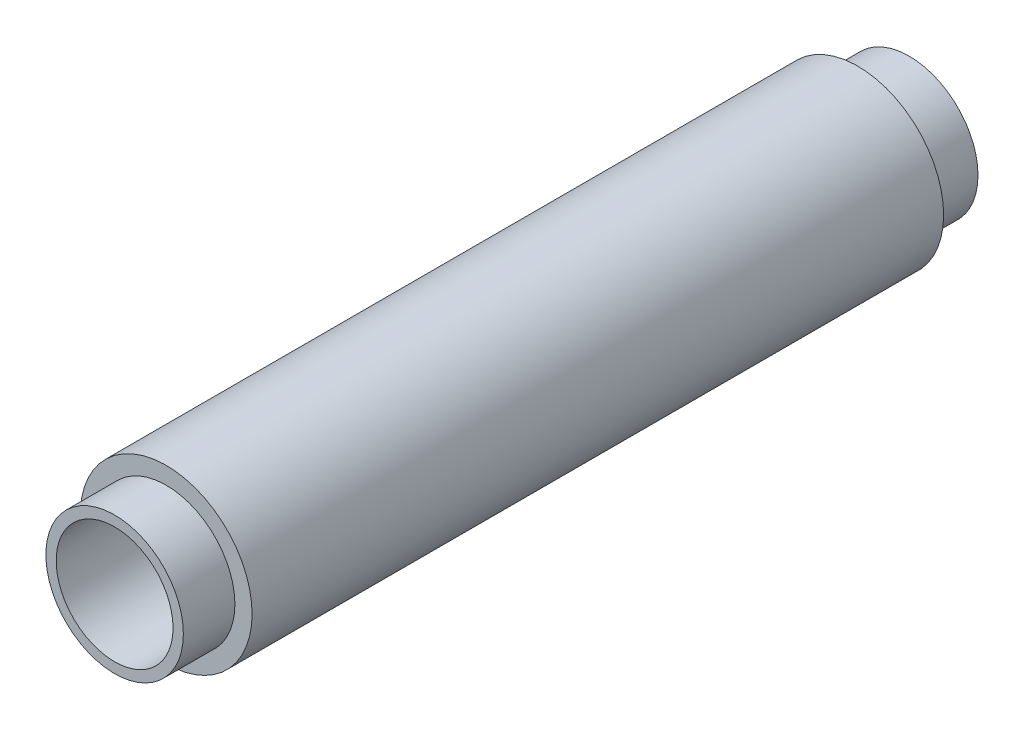
ISO-10303-21;
HEADER;
FILE_DESCRIPTION(('STEP AP214'),'2;1');
FILE_NAME('part.step','',(''),(''),'','','');
FILE_SCHEMA(('AUTOMOTIVE_DESIGN { 1 0 10303 214 1 1 1 1 }'));
ENDSEC;
DATA;
#1=APPLICATION_CONTEXT('core data for automotive mechanical design processes');
#2=APPLICATION_PROTOCOL_DEFINITION('international standard','automotive_design',2000,#1);
#3=PRODUCT_CONTEXT('',#1,'mechanical');
#4=PRODUCT('Part','Part','',(#3));
#5=PRODUCT_RELATED_PRODUCT_CATEGORY('part','',(#4));
#6=PRODUCT_DEFINITION_FORMATION('','',#4);
#7=PRODUCT_DEFINITION_CONTEXT('part definition',#1,'design');
#8=PRODUCT_DEFINITION('design','',#6,#7);
#9=PRODUCT_DEFINITION_SHAPE('','',#8);
#10=(LENGTH_UNIT() NAMED_UNIT(*) SI_UNIT(.MILLI.,.METRE.));
#11=(NAMED_UNIT(*) PLANE_ANGLE_UNIT() SI_UNIT($,.RADIAN.));
#12=(NAMED_UNIT(*) SI_UNIT($,.STERADIAN.) SOLID_ANGLE_UNIT());
#13=UNCERTAINTY_MEASURE_WITH_UNIT(LENGTH_MEASURE(1.E-05),#10,'distance_accuracy_value','');
#14=(GEOMETRIC_REPRESENTATION_CONTEXT(3) GLOBAL_UNCERTAINTY_ASSIGNED_CONTEXT((#13)) GLOBAL_UNIT_ASSIGNED_CONTEXT((#10,
#11,#12)) REPRESENTATION_CONTEXT('',''));
#15=CARTESIAN_POINT('',(0.,0.,0.));
#16=DIRECTION('',(0.,0.,1.));
#17=DIRECTION('',(1.,0.,0.));
#18=AXIS2_PLACEMENT_3D('',#15,#16,#17);
#19=CARTESIAN_POINT('',(3.43024899888577E-12,0.,1000.));
#20=DIRECTION('',(0.,0.,1.));
#21=DIRECTION('',(1.,0.,0.));
#22=AXIS2_PLACEMENT_3D('',#19,#20,#21);
#23=CYLINDRICAL_SURFACE('',#22,25.0000000000002);
#24=CARTESIAN_POINT('',(3.45083049287907E-13,0.,100.6));
#25=DIRECTION('',(0.,0.,1.));
#26=DIRECTION('',(1.,0.,0.));
#27=AXIS2_PLACEMENT_3D('',#24,#25,#26);
#28=CIRCLE('',#27,25.0000000000003);
#29=CARTESIAN_POINT('',(25.0000000000007,0.,100.599999999999));
#30=VERTEX_POINT('',#29);
#31=EDGE_CURVE('E47',#30,#30,#28,.T.);
#32=ORIENTED_EDGE('',*,*,#31,.F.);
#33=EDGE_LOOP('',(#32));
#34=FACE_BOUND('',#33,.T.);
#35=CARTESIAN_POINT('',(-3.45083049287907E-13,0.,-100.6));
#36=DIRECTION('',(0.,0.,1.));
#37=DIRECTION('',(1.,0.,0.));
#38=AXIS2_PLACEMENT_3D('',#35,#36,#37);
#39=CIRCLE('',#38,25.0000000000003);
#40=CARTESIAN_POINT('',(25.,0.,-100.6));
#41=VERTEX_POINT('',#40);
#42=EDGE_CURVE('E61',#41,#41,#39,.T.);
#43=ORIENTED_EDGE('',*,*,#42,.T.);
#44=EDGE_LOOP('',(#43));
#45=FACE_BOUND('',#44,.T.);
#46=ADVANCED_FACE('F33',(#34,#45),#23,.T.);
#47=CARTESIAN_POINT('',(3.43024899888577E-12,0.,1000.));
#48=DIRECTION('',(0.,0.,1.));
#49=DIRECTION('',(1.,0.,0.));
#50=AXIS2_PLACEMENT_3D('',#47,#48,#49);
#51=CYLINDRICAL_SURFACE('',#50,17.0000000000002);
#52=CARTESIAN_POINT('',(3.96536784271193E-13,0.,115.6));
#53=DIRECTION('',(0.,0.,1.));
#54=DIRECTION('',(1.,0.,0.));
#55=AXIS2_PLACEMENT_3D('',#52,#53,#54);
#56=CIRCLE('',#55,17.0000000000004);
#57=CARTESIAN_POINT('',(17.0000000000008,0.,115.6));
#58=VERTEX_POINT('',#57);
#59=EDGE_CURVE('E10',#58,#58,#56,.T.);
#60=ORIENTED_EDGE('',*,*,#59,.T.);
#61=EDGE_LOOP('',(#60));
#62=FACE_BOUND('',#61,.T.);
#63=CARTESIAN_POINT('',(-3.96536784271193E-13,0.,-115.6));
#64=DIRECTION('',(0.,0.,1.));
#65=DIRECTION('',(1.,0.,0.));
#66=AXIS2_PLACEMENT_3D('',#63,#64,#65);
#67=CIRCLE('',#66,17.0000000000004);
#68=CARTESIAN_POINT('',(17.,0.,-115.6));
#69=VERTEX_POINT('',#68);
#70=EDGE_CURVE('E52',#69,#69,#67,.T.);
#71=ORIENTED_EDGE('',*,*,#70,.F.);
#72=EDGE_LOOP('',(#71));
#73=FACE_BOUND('',#72,.T.);
#74=ADVANCED_FACE('F78',(#62,#73),#51,.F.);
#75=CARTESIAN_POINT('',(-20.,0.,115.6));
#76=DIRECTION('',(0.,0.,-1.));
#77=DIRECTION('',(-1.,0.,0.));
#78=AXIS2_PLACEMENT_3D('',#75,#76,#77);
#79=PLANE('',#78);
#80=ORIENTED_EDGE('',*,*,#59,.F.);
#81=EDGE_LOOP('',(#80));
#82=FACE_BOUND('',#81,.T.);
#83=CARTESIAN_POINT('',(3.96536784271193E-13,0.,115.6));
#84=DIRECTION('',(0.,0.,1.));
#85=DIRECTION('',(1.,0.,0.));
#86=AXIS2_PLACEMENT_3D('',#83,#84,#85);
#87=CIRCLE('',#86,20.0000000000004);
#88=CARTESIAN_POINT('',(20.0000000000008,0.,115.6));
#89=VERTEX_POINT('',#88);
#90=EDGE_CURVE('E39',#89,#89,#87,.T.);
#91=ORIENTED_EDGE('',*,*,#90,.T.);
#92=EDGE_LOOP('',(#91));
#93=FACE_BOUND('',#92,.T.);
#94=ADVANCED_FACE('F83',(#82,#93),#79,.F.);
#95=CARTESIAN_POINT('',(3.43024899888577E-12,0.,1000.));
#96=DIRECTION('',(0.,0.,1.));
#97=DIRECTION('',(1.,0.,0.));
#98=AXIS2_PLACEMENT_3D('',#95,#96,#97);
#99=CYLINDRICAL_SURFACE('',#98,20.0000000000004);
#100=ORIENTED_EDGE('',*,*,#90,.F.);
#101=EDGE_LOOP('',(#100));
#102=FACE_BOUND('',#101,.T.);
#103=CARTESIAN_POINT('',(3.45083049287907E-13,0.,100.6));
#104=DIRECTION('',(0.,0.,1.));
#105=DIRECTION('',(1.,0.,0.));
#106=AXIS2_PLACEMENT_3D('',#103,#104,#105);
#107=CIRCLE('',#106,20.0000000000003);
#108=CARTESIAN_POINT('',(20.0000000000007,0.,100.6));
#109=VERTEX_POINT('',#108);
#110=EDGE_CURVE('E43',#109,#109,#107,.T.);
#111=ORIENTED_EDGE('',*,*,#110,.T.);
#112=EDGE_LOOP('',(#111));
#113=FACE_BOUND('',#112,.T.);
#114=ADVANCED_FACE('F88',(#102,#113),#99,.T.);
#115=CARTESIAN_POINT('',(-20.,0.,100.6));
#116=DIRECTION('',(0.,0.,-1.));
#117=DIRECTION('',(-1.,0.,0.));
#118=AXIS2_PLACEMENT_3D('',#115,#116,#117);
#119=PLANE('',#118);
#120=ORIENTED_EDGE('',*,*,#110,.F.);
#121=EDGE_LOOP('',(#120));
#122=FACE_BOUND('',#121,.T.);
#123=ORIENTED_EDGE('',*,*,#31,.T.);
#124=EDGE_LOOP('',(#123));
#125=FACE_BOUND('',#124,.T.);
#126=ADVANCED_FACE('F86',(#122,#125),#119,.F.);
#127=CARTESIAN_POINT('',(-20.0000000000008,0.,-115.6));
#128=DIRECTION('',(0.,0.,1.));
#129=DIRECTION('',(-1.,0.,0.));
#130=AXIS2_PLACEMENT_3D('',#127,#128,#129);
#131=PLANE('',#130);
#132=ORIENTED_EDGE('',*,*,#70,.T.);
#133=EDGE_LOOP('',(#132));
#134=FACE_BOUND('',#133,.T.);
#135=CARTESIAN_POINT('',(-3.96536784271193E-13,0.,-115.6));
#136=DIRECTION('',(0.,0.,1.));
#137=DIRECTION('',(1.,0.,0.));
#138=AXIS2_PLACEMENT_3D('',#135,#136,#137);
#139=CIRCLE('',#138,20.0000000000004);
#140=CARTESIAN_POINT('',(20.,0.,-115.6));
#141=VERTEX_POINT('',#140);
#142=EDGE_CURVE('E55',#141,#141,#139,.T.);
#143=ORIENTED_EDGE('',*,*,#142,.F.);
#144=EDGE_LOOP('',(#143));
#145=FACE_BOUND('',#144,.T.);
#146=ADVANCED_FACE('F74',(#134,#145),#131,.F.);
#147=CARTESIAN_POINT('',(-3.43024899888577E-12,0.,-1000.));
#148=DIRECTION('',(0.,0.,-1.));
#149=DIRECTION('',(1.,0.,0.));
#150=AXIS2_PLACEMENT_3D('',#147,#148,#149);
#151=CYLINDRICAL_SURFACE('',#150,20.0000000000004);
#152=ORIENTED_EDGE('',*,*,#142,.T.);
#153=EDGE_LOOP('',(#152));
#154=FACE_BOUND('',#153,.T.);
#155=CARTESIAN_POINT('',(-3.45083049287907E-13,0.,-100.6));
#156=DIRECTION('',(0.,0.,1.));
#157=DIRECTION('',(1.,0.,0.));
#158=AXIS2_PLACEMENT_3D('',#155,#156,#157);
#159=CIRCLE('',#158,20.0000000000003);
#160=CARTESIAN_POINT('',(20.,0.,-100.6));
#161=VERTEX_POINT('',#160);
#162=EDGE_CURVE('E58',#161,#161,#159,.T.);
#163=ORIENTED_EDGE('',*,*,#162,.F.);
#164=EDGE_LOOP('',(#163));
#165=FACE_BOUND('',#164,.T.);
#166=ADVANCED_FACE('F68',(#154,#165),#151,.T.);
#167=CARTESIAN_POINT('',(-20.0000000000007,0.,-100.6));
#168=DIRECTION('',(0.,0.,1.));
#169=DIRECTION('',(-1.,0.,0.));
#170=AXIS2_PLACEMENT_3D('',#167,#168,#169);
#171=PLANE('',#170);
#172=ORIENTED_EDGE('',*,*,#162,.T.);
#173=EDGE_LOOP('',(#172));
#174=FACE_BOUND('',#173,.T.);
#175=ORIENTED_EDGE('',*,*,#42,.F.);
#176=EDGE_LOOP('',(#175));
#177=FACE_BOUND('',#176,.T.);
#178=ADVANCED_FACE('F66',(#174,#177),#171,.F.);
#179=CLOSED_SHELL('',(#46,#74,#94,#114,#126,#146,#166,#178));
#180=MANIFOLD_SOLID_BREP('B2',#179);
#181=ADVANCED_BREP_SHAPE_REPRESENTATION('',(#18,#180),#14);
#182=SHAPE_DEFINITION_REPRESENTATION(#9,#181);
ENDSEC;
END-ISO-10303-21;
